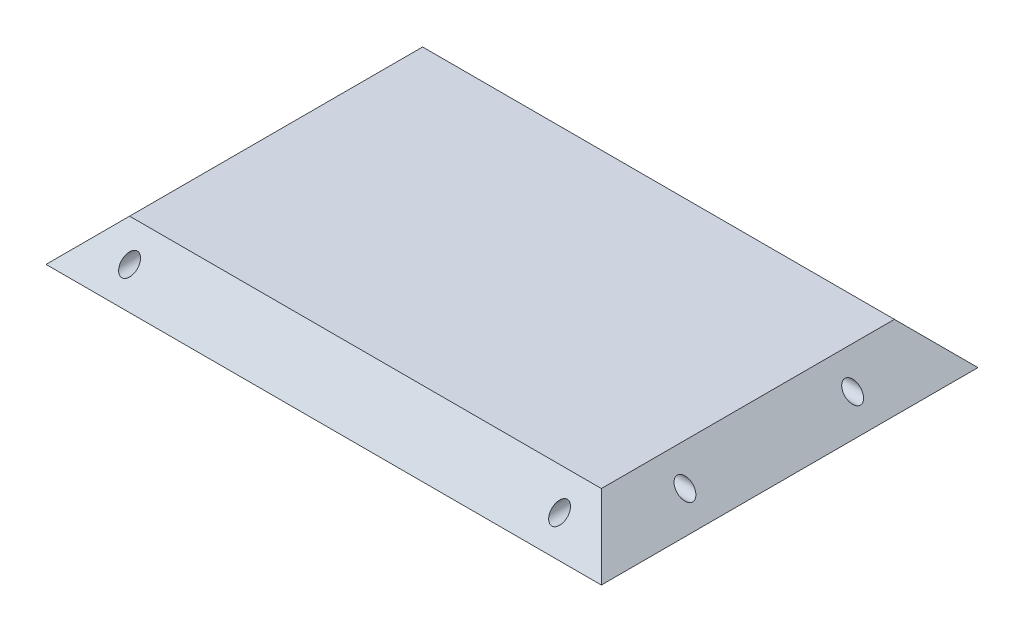
ISO-10303-21;
HEADER;
FILE_DESCRIPTION(('STEP AP214'),'2;1');
FILE_NAME('part.step','',(''),(''),'','','');
FILE_SCHEMA(('AUTOMOTIVE_DESIGN { 1 0 10303 214 1 1 1 1 }'));
ENDSEC;
DATA;
#1=APPLICATION_CONTEXT('core data for automotive mechanical design processes');
#2=APPLICATION_PROTOCOL_DEFINITION('international standard','automotive_design',2000,#1);
#3=PRODUCT_CONTEXT('',#1,'mechanical');
#4=PRODUCT('Part','Part','',(#3));
#5=PRODUCT_RELATED_PRODUCT_CATEGORY('part','',(#4));
#6=PRODUCT_DEFINITION_FORMATION('','',#4);
#7=PRODUCT_DEFINITION_CONTEXT('part definition',#1,'design');
#8=PRODUCT_DEFINITION('design','',#6,#7);
#9=PRODUCT_DEFINITION_SHAPE('','',#8);
#10=(LENGTH_UNIT() NAMED_UNIT(*) SI_UNIT(.MILLI.,.METRE.));
#11=(NAMED_UNIT(*) PLANE_ANGLE_UNIT() SI_UNIT($,.RADIAN.));
#12=(NAMED_UNIT(*) SI_UNIT($,.STERADIAN.) SOLID_ANGLE_UNIT());
#13=UNCERTAINTY_MEASURE_WITH_UNIT(LENGTH_MEASURE(1.E-05),#10,'distance_accuracy_value','');
#14=(GEOMETRIC_REPRESENTATION_CONTEXT(3) GLOBAL_UNCERTAINTY_ASSIGNED_CONTEXT((#13)) GLOBAL_UNIT_ASSIGNED_CONTEXT((#10,
#11,#12)) REPRESENTATION_CONTEXT('',''));
#15=CARTESIAN_POINT('',(0.,0.,0.));
#16=DIRECTION('',(0.,0.,1.));
#17=DIRECTION('',(1.,0.,0.));
#18=AXIS2_PLACEMENT_3D('',#15,#16,#17);
#19=CARTESIAN_POINT('',(-33.224504084014,33.224504084014,0.));
#20=DIRECTION('',(0.707106781186547,-0.707106781186547,0.));
#21=DIRECTION('',(0.707106781186548,0.707106781186547,0.));
#22=AXIS2_PLACEMENT_3D('',#19,#20,#21);
#23=PLANE('',#22);
#24=DIRECTION('',(0.577350269189626,0.577350269189626,-0.577350269189626));
#25=VECTOR('',#24,1.);
#26=CARTESIAN_POINT('',(-66.449008168028,0.,45.0615743649583));
#27=LINE('',#26,#25);
#28=CARTESIAN_POINT('',(-66.449008168028,0.,45.0615743649583));
#29=VERTEX_POINT('',#28);
#30=CARTESIAN_POINT('',(-56.449008168028,10.,35.0615743649583));
#31=VERTEX_POINT('',#30);
#32=EDGE_CURVE('E72',#29,#31,#27,.T.);
#33=ORIENTED_EDGE('',*,*,#32,.T.);
#34=DIRECTION('',(0.,0.,1.));
#35=VECTOR('',#34,1.);
#36=CARTESIAN_POINT('',(-56.449008168028,10.,-35.0615743649583));
#37=LINE('',#36,#35);
#38=CARTESIAN_POINT('',(-56.449008168028,10.,-35.0615743649583));
#39=VERTEX_POINT('',#38);
#40=EDGE_CURVE('E57',#39,#31,#37,.T.);
#41=ORIENTED_EDGE('',*,*,#40,.F.);
#42=DIRECTION('',(0.577350269189626,0.577350269189626,0.577350269189626));
#43=VECTOR('',#42,1.);
#44=CARTESIAN_POINT('',(-66.449008168028,0.,-45.0615743649583));
#45=LINE('',#44,#43);
#46=CARTESIAN_POINT('',(-66.449008168028,0.,-45.0615743649583));
#47=VERTEX_POINT('',#46);
#48=EDGE_CURVE('E112',#47,#39,#45,.T.);
#49=ORIENTED_EDGE('',*,*,#48,.F.);
#50=DIRECTION('',(0.,0.,1.));
#51=VECTOR('',#50,1.);
#52=CARTESIAN_POINT('',(-66.449008168028,0.,45.0615743649583));
#53=LINE('',#52,#51);
#54=EDGE_CURVE('E90',#47,#29,#53,.T.);
#55=ORIENTED_EDGE('',*,*,#54,.T.);
#56=EDGE_LOOP('',(#33,#41,#49,#55));
#57=FACE_BOUND('',#56,.T.);
#58=CARTESIAN_POINT('',(-61.449008168028,5.,20.0615743649583));
#59=DIRECTION('',(0.707106781186547,-0.707106781186547,0.));
#60=DIRECTION('',(-0.707106781186548,-0.707106781186547,0.));
#61=AXIS2_PLACEMENT_3D('',#58,#59,#60);
#62=ELLIPSE('',#61,2.61629509039023,1.85);
#63=CARTESIAN_POINT('',(-63.299008168028,3.15,20.0615743649583));
#64=VERTEX_POINT('',#63);
#65=EDGE_CURVE('E247',#64,#64,#62,.F.);
#66=ORIENTED_EDGE('',*,*,#65,.F.);
#67=EDGE_LOOP('',(#66));
#68=FACE_BOUND('',#67,.T.);
#69=CARTESIAN_POINT('',(-61.449008168028,5.,-20.0615743649583));
#70=DIRECTION('',(0.707106781186547,-0.707106781186547,0.));
#71=DIRECTION('',(-0.707106781186548,-0.707106781186547,0.));
#72=AXIS2_PLACEMENT_3D('',#69,#70,#71);
#73=ELLIPSE('',#72,2.61629509039023,1.85);
#74=CARTESIAN_POINT('',(-63.299008168028,3.15,-20.0615743649583));
#75=VERTEX_POINT('',#74);
#76=EDGE_CURVE('E52',#75,#75,#73,.T.);
#77=ORIENTED_EDGE('',*,*,#76,.T.);
#78=EDGE_LOOP('',(#77));
#79=FACE_BOUND('',#78,.T.);
#80=ADVANCED_FACE('F47',(#57,#68,#79),#23,.F.);
#81=CARTESIAN_POINT('',(33.224504084014,33.224504084014,0.));
#82=DIRECTION('',(-0.707106781186547,-0.707106781186547,0.));
#83=DIRECTION('',(0.707106781186548,-0.707106781186547,0.));
#84=AXIS2_PLACEMENT_3D('',#81,#82,#83);
#85=PLANE('',#84);
#86=CARTESIAN_POINT('',(61.449008168028,5.,20.0615743649583));
#87=DIRECTION('',(-0.707106781186547,-0.707106781186547,0.));
#88=DIRECTION('',(0.707106781186548,-0.707106781186547,0.));
#89=AXIS2_PLACEMENT_3D('',#86,#87,#88);
#90=ELLIPSE('',#89,2.61629509039023,1.85);
#91=CARTESIAN_POINT('',(63.299008168028,3.15,20.0615743649583));
#92=VERTEX_POINT('',#91);
#93=EDGE_CURVE('E240',#92,#92,#90,.T.);
#94=ORIENTED_EDGE('',*,*,#93,.T.);
#95=EDGE_LOOP('',(#94));
#96=FACE_BOUND('',#95,.T.);
#97=DIRECTION('',(-0.577350269189626,0.577350269189626,0.577350269189626));
#98=VECTOR('',#97,1.);
#99=CARTESIAN_POINT('',(66.449008168028,0.,-45.0615743649583));
#100=LINE('',#99,#98);
#101=CARTESIAN_POINT('',(66.449008168028,0.,-45.0615743649583));
#102=VERTEX_POINT('',#101);
#103=CARTESIAN_POINT('',(56.449008168028,10.,-35.0615743649583));
#104=VERTEX_POINT('',#103);
#105=EDGE_CURVE('E115',#102,#104,#100,.T.);
#106=ORIENTED_EDGE('',*,*,#105,.T.);
#107=DIRECTION('',(0.,0.,-1.));
#108=VECTOR('',#107,1.);
#109=CARTESIAN_POINT('',(56.449008168028,10.,35.0615743649583));
#110=LINE('',#109,#108);
#111=CARTESIAN_POINT('',(56.449008168028,10.,35.0615743649583));
#112=VERTEX_POINT('',#111);
#113=EDGE_CURVE('E213',#112,#104,#110,.T.);
#114=ORIENTED_EDGE('',*,*,#113,.F.);
#115=DIRECTION('',(-0.577350269189626,0.577350269189626,-0.577350269189626));
#116=VECTOR('',#115,1.);
#117=CARTESIAN_POINT('',(66.449008168028,0.,45.0615743649583));
#118=LINE('',#117,#116);
#119=CARTESIAN_POINT('',(66.449008168028,0.,45.0615743649583));
#120=VERTEX_POINT('',#119);
#121=EDGE_CURVE('E122',#120,#112,#118,.T.);
#122=ORIENTED_EDGE('',*,*,#121,.F.);
#123=DIRECTION('',(0.,0.,-1.));
#124=VECTOR('',#123,1.);
#125=CARTESIAN_POINT('',(66.449008168028,0.,45.0615743649583));
#126=LINE('',#125,#124);
#127=EDGE_CURVE('E116',#120,#102,#126,.T.);
#128=ORIENTED_EDGE('',*,*,#127,.T.);
#129=EDGE_LOOP('',(#106,#114,#122,#128));
#130=FACE_BOUND('',#129,.T.);
#131=CARTESIAN_POINT('',(61.449008168028,5.,-20.0615743649583));
#132=DIRECTION('',(-0.707106781186547,-0.707106781186547,0.));
#133=DIRECTION('',(0.707106781186548,-0.707106781186547,0.));
#134=AXIS2_PLACEMENT_3D('',#131,#132,#133);
#135=ELLIPSE('',#134,2.61629509039023,1.85);
#136=CARTESIAN_POINT('',(63.299008168028,3.15,-20.0615743649583));
#137=VERTEX_POINT('',#136);
#138=EDGE_CURVE('E243',#137,#137,#135,.F.);
#139=ORIENTED_EDGE('',*,*,#138,.F.);
#140=EDGE_LOOP('',(#139));
#141=FACE_BOUND('',#140,.T.);
#142=ADVANCED_FACE('F146',(#96,#130,#141),#85,.F.);
#143=CARTESIAN_POINT('',(0.,22.5307871824791,-22.5307871824791));
#144=DIRECTION('',(0.,-0.707106781186547,0.707106781186547));
#145=DIRECTION('',(0.,-0.707106781186547,-0.707106781186548));
#146=AXIS2_PLACEMENT_3D('',#143,#144,#145);
#147=PLANE('',#146);
#148=CARTESIAN_POINT('',(-51.449008168028,5.,-40.0615743649582));
#149=DIRECTION('',(0.,-0.707106781186547,0.707106781186547));
#150=DIRECTION('',(0.,-0.707106781186547,-0.707106781186548));
#151=AXIS2_PLACEMENT_3D('',#148,#149,#150);
#152=ELLIPSE('',#151,2.61629509039022,1.85);
#153=CARTESIAN_POINT('',(-51.449008168028,3.15,-41.9115743649582));
#154=VERTEX_POINT('',#153);
#155=EDGE_CURVE('E232',#154,#154,#152,.T.);
#156=ORIENTED_EDGE('',*,*,#155,.T.);
#157=EDGE_LOOP('',(#156));
#158=FACE_BOUND('',#157,.T.);
#159=ORIENTED_EDGE('',*,*,#48,.T.);
#160=DIRECTION('',(-1.,0.,0.));
#161=VECTOR('',#160,1.);
#162=CARTESIAN_POINT('',(56.449008168028,10.,-35.0615743649583));
#163=LINE('',#162,#161);
#164=EDGE_CURVE('E207',#104,#39,#163,.T.);
#165=ORIENTED_EDGE('',*,*,#164,.F.);
#166=ORIENTED_EDGE('',*,*,#105,.F.);
#167=DIRECTION('',(-1.,0.,0.));
#168=VECTOR('',#167,1.);
#169=CARTESIAN_POINT('',(-66.449008168028,0.,-45.0615743649583));
#170=LINE('',#169,#168);
#171=EDGE_CURVE('E95',#102,#47,#170,.T.);
#172=ORIENTED_EDGE('',*,*,#171,.T.);
#173=EDGE_LOOP('',(#159,#165,#166,#172));
#174=FACE_BOUND('',#173,.T.);
#175=CARTESIAN_POINT('',(51.449008168028,5.,-40.0615743649582));
#176=DIRECTION('',(0.,-0.707106781186547,0.707106781186547));
#177=DIRECTION('',(0.,-0.707106781186547,-0.707106781186548));
#178=AXIS2_PLACEMENT_3D('',#175,#176,#177);
#179=ELLIPSE('',#178,2.61629509039022,1.85);
#180=CARTESIAN_POINT('',(51.449008168028,3.15,-41.9115743649582));
#181=VERTEX_POINT('',#180);
#182=EDGE_CURVE('E235',#181,#181,#179,.F.);
#183=ORIENTED_EDGE('',*,*,#182,.F.);
#184=EDGE_LOOP('',(#183));
#185=FACE_BOUND('',#184,.T.);
#186=ADVANCED_FACE('F110',(#158,#174,#185),#147,.F.);
#187=CARTESIAN_POINT('',(0.,22.5307871824791,22.5307871824791));
#188=DIRECTION('',(0.,-0.707106781186547,-0.707106781186547));
#189=DIRECTION('',(0.,0.707106781186547,-0.707106781186548));
#190=AXIS2_PLACEMENT_3D('',#187,#188,#189);
#191=PLANE('',#190);
#192=ORIENTED_EDGE('',*,*,#121,.T.);
#193=DIRECTION('',(1.,0.,0.));
#194=VECTOR('',#193,1.);
#195=CARTESIAN_POINT('',(-56.449008168028,10.,35.0615743649583));
#196=LINE('',#195,#194);
#197=EDGE_CURVE('E12',#31,#112,#196,.T.);
#198=ORIENTED_EDGE('',*,*,#197,.F.);
#199=ORIENTED_EDGE('',*,*,#32,.F.);
#200=DIRECTION('',(1.,0.,0.));
#201=VECTOR('',#200,1.);
#202=CARTESIAN_POINT('',(-66.449008168028,0.,45.0615743649583));
#203=LINE('',#202,#201);
#204=EDGE_CURVE('E99',#29,#120,#203,.T.);
#205=ORIENTED_EDGE('',*,*,#204,.T.);
#206=EDGE_LOOP('',(#192,#198,#199,#205));
#207=FACE_BOUND('',#206,.T.);
#208=CARTESIAN_POINT('',(-51.449008168028,5.,40.0615743649582));
#209=DIRECTION('',(0.,-0.707106781186547,-0.707106781186547));
#210=DIRECTION('',(0.,-0.707106781186547,0.707106781186548));
#211=AXIS2_PLACEMENT_3D('',#208,#209,#210);
#212=ELLIPSE('',#211,2.61629509039022,1.85);
#213=CARTESIAN_POINT('',(-51.449008168028,3.15,41.9115743649582));
#214=VERTEX_POINT('',#213);
#215=EDGE_CURVE('E220',#214,#214,#212,.F.);
#216=ORIENTED_EDGE('',*,*,#215,.F.);
#217=EDGE_LOOP('',(#216));
#218=FACE_BOUND('',#217,.T.);
#219=CARTESIAN_POINT('',(51.449008168028,5.,40.0615743649582));
#220=DIRECTION('',(0.,-0.707106781186547,-0.707106781186547));
#221=DIRECTION('',(0.,-0.707106781186547,0.707106781186548));
#222=AXIS2_PLACEMENT_3D('',#219,#220,#221);
#223=ELLIPSE('',#222,2.61629509039022,1.85);
#224=CARTESIAN_POINT('',(51.449008168028,3.15,41.9115743649582));
#225=VERTEX_POINT('',#224);
#226=EDGE_CURVE('E228',#225,#225,#223,.T.);
#227=ORIENTED_EDGE('',*,*,#226,.T.);
#228=EDGE_LOOP('',(#227));
#229=FACE_BOUND('',#228,.T.);
#230=ADVANCED_FACE('F279',(#207,#218,#229),#191,.F.);
#231=CARTESIAN_POINT('',(0.,10.,0.));
#232=DIRECTION('',(0.,1.,0.));
#233=DIRECTION('',(0.,0.,1.));
#234=AXIS2_PLACEMENT_3D('',#231,#232,#233);
#235=PLANE('',#234);
#236=ORIENTED_EDGE('',*,*,#113,.T.);
#237=ORIENTED_EDGE('',*,*,#164,.T.);
#238=ORIENTED_EDGE('',*,*,#40,.T.);
#239=ORIENTED_EDGE('',*,*,#197,.T.);
#240=EDGE_LOOP('',(#236,#237,#238,#239));
#241=FACE_BOUND('',#240,.T.);
#242=ADVANCED_FACE('F49',(#241),#235,.T.);
#243=CARTESIAN_POINT('',(0.,0.,0.));
#244=DIRECTION('',(0.,-1.,0.));
#245=DIRECTION('',(0.,0.,-1.));
#246=AXIS2_PLACEMENT_3D('',#243,#244,#245);
#247=PLANE('',#246);
#248=ORIENTED_EDGE('',*,*,#127,.F.);
#249=ORIENTED_EDGE('',*,*,#204,.F.);
#250=ORIENTED_EDGE('',*,*,#54,.F.);
#251=ORIENTED_EDGE('',*,*,#171,.F.);
#252=EDGE_LOOP('',(#248,#249,#250,#251));
#253=FACE_BOUND('',#252,.T.);
#254=ADVANCED_FACE('F94',(#253),#247,.T.);
#255=CARTESIAN_POINT('',(-51.449008168028,5.,25.0615743649583));
#256=DIRECTION('',(0.,0.,1.));
#257=DIRECTION('',(1.,0.,0.));
#258=AXIS2_PLACEMENT_3D('',#255,#256,#257);
#259=CYLINDRICAL_SURFACE('',#258,1.85);
#260=CARTESIAN_POINT('',(-51.449008168028,5.,25.0615743649583));
#261=DIRECTION('',(0.,0.,-1.));
#262=DIRECTION('',(-1.,0.,0.));
#263=AXIS2_PLACEMENT_3D('',#260,#261,#262);
#264=CIRCLE('',#263,1.85);
#265=CARTESIAN_POINT('',(-53.299008168028,5.,25.0615743649583));
#266=VERTEX_POINT('',#265);
#267=EDGE_CURVE('E239',#266,#266,#264,.T.);
#268=ORIENTED_EDGE('',*,*,#267,.T.);
#269=EDGE_LOOP('',(#268));
#270=FACE_BOUND('',#269,.T.);
#271=ORIENTED_EDGE('',*,*,#215,.T.);
#272=EDGE_LOOP('',(#271));
#273=FACE_BOUND('',#272,.T.);
#274=ADVANCED_FACE('F355',(#270,#273),#259,.F.);
#275=CARTESIAN_POINT('',(-51.449008168028,5.,25.0615743649583));
#276=DIRECTION('',(0.,0.,-1.));
#277=DIRECTION('',(-1.,0.,0.));
#278=AXIS2_PLACEMENT_3D('',#275,#276,#277);
#279=PLANE('',#278);
#280=ORIENTED_EDGE('',*,*,#267,.F.);
#281=EDGE_LOOP('',(#280));
#282=FACE_BOUND('',#281,.T.);
#283=ADVANCED_FACE('F345',(#282),#279,.F.);
#284=CARTESIAN_POINT('',(51.449008168028,5.,25.0615743649583));
#285=DIRECTION('',(0.,0.,1.));
#286=DIRECTION('',(1.,0.,0.));
#287=AXIS2_PLACEMENT_3D('',#284,#285,#286);
#288=CYLINDRICAL_SURFACE('',#287,1.85);
#289=CARTESIAN_POINT('',(51.449008168028,5.,25.0615743649583));
#290=DIRECTION('',(0.,0.,1.));
#291=DIRECTION('',(1.,0.,0.));
#292=AXIS2_PLACEMENT_3D('',#289,#290,#291);
#293=CIRCLE('',#292,1.85);
#294=CARTESIAN_POINT('',(53.299008168028,5.,25.0615743649583));
#295=VERTEX_POINT('',#294);
#296=EDGE_CURVE('E229',#295,#295,#293,.T.);
#297=ORIENTED_EDGE('',*,*,#296,.F.);
#298=EDGE_LOOP('',(#297));
#299=FACE_BOUND('',#298,.T.);
#300=ORIENTED_EDGE('',*,*,#226,.F.);
#301=EDGE_LOOP('',(#300));
#302=FACE_BOUND('',#301,.T.);
#303=ADVANCED_FACE('F342',(#299,#302),#288,.F.);
#304=CARTESIAN_POINT('',(51.449008168028,5.,25.0615743649583));
#305=DIRECTION('',(0.,0.,1.));
#306=DIRECTION('',(1.,0.,0.));
#307=AXIS2_PLACEMENT_3D('',#304,#305,#306);
#308=PLANE('',#307);
#309=ORIENTED_EDGE('',*,*,#296,.T.);
#310=EDGE_LOOP('',(#309));
#311=FACE_BOUND('',#310,.T.);
#312=ADVANCED_FACE('F344',(#311),#308,.T.);
#313=CARTESIAN_POINT('',(-51.449008168028,5.,-25.0615743649583));
#314=DIRECTION('',(0.,0.,-1.));
#315=DIRECTION('',(-1.,0.,0.));
#316=AXIS2_PLACEMENT_3D('',#313,#314,#315);
#317=CYLINDRICAL_SURFACE('',#316,1.85);
#318=CARTESIAN_POINT('',(-51.449008168028,5.,-25.0615743649583));
#319=DIRECTION('',(0.,0.,-1.));
#320=DIRECTION('',(-1.,0.,0.));
#321=AXIS2_PLACEMENT_3D('',#318,#319,#320);
#322=CIRCLE('',#321,1.85);
#323=CARTESIAN_POINT('',(-53.299008168028,5.,-25.0615743649583));
#324=VERTEX_POINT('',#323);
#325=EDGE_CURVE('E246',#324,#324,#322,.T.);
#326=ORIENTED_EDGE('',*,*,#325,.F.);
#327=EDGE_LOOP('',(#326));
#328=FACE_BOUND('',#327,.T.);
#329=ORIENTED_EDGE('',*,*,#155,.F.);
#330=EDGE_LOOP('',(#329));
#331=FACE_BOUND('',#330,.T.);
#332=ADVANCED_FACE('F352',(#328,#331),#317,.F.);
#333=CARTESIAN_POINT('',(-51.449008168028,5.,-25.0615743649583));
#334=DIRECTION('',(0.,0.,1.));
#335=DIRECTION('',(-1.,0.,0.));
#336=AXIS2_PLACEMENT_3D('',#333,#334,#335);
#337=PLANE('',#336);
#338=ORIENTED_EDGE('',*,*,#325,.T.);
#339=EDGE_LOOP('',(#338));
#340=FACE_BOUND('',#339,.T.);
#341=ADVANCED_FACE('F467',(#340),#337,.F.);
#342=CARTESIAN_POINT('',(51.449008168028,5.,-25.0615743649583));
#343=DIRECTION('',(0.,0.,-1.));
#344=DIRECTION('',(-1.,0.,0.));
#345=AXIS2_PLACEMENT_3D('',#342,#343,#344);
#346=CYLINDRICAL_SURFACE('',#345,1.85);
#347=CARTESIAN_POINT('',(51.449008168028,5.,-25.0615743649583));
#348=DIRECTION('',(0.,0.,1.));
#349=DIRECTION('',(1.,0.,0.));
#350=AXIS2_PLACEMENT_3D('',#347,#348,#349);
#351=CIRCLE('',#350,1.85);
#352=CARTESIAN_POINT('',(53.299008168028,5.,-25.0615743649583));
#353=VERTEX_POINT('',#352);
#354=EDGE_CURVE('E236',#353,#353,#351,.T.);
#355=ORIENTED_EDGE('',*,*,#354,.T.);
#356=EDGE_LOOP('',(#355));
#357=FACE_BOUND('',#356,.T.);
#358=ORIENTED_EDGE('',*,*,#182,.T.);
#359=EDGE_LOOP('',(#358));
#360=FACE_BOUND('',#359,.T.);
#361=ADVANCED_FACE('F463',(#357,#360),#346,.F.);
#362=CARTESIAN_POINT('',(51.449008168028,5.,-25.0615743649583));
#363=DIRECTION('',(0.,0.,-1.));
#364=DIRECTION('',(1.,0.,0.));
#365=AXIS2_PLACEMENT_3D('',#362,#363,#364);
#366=PLANE('',#365);
#367=ORIENTED_EDGE('',*,*,#354,.F.);
#368=EDGE_LOOP('',(#367));
#369=FACE_BOUND('',#368,.T.);
#370=ADVANCED_FACE('F456',(#369),#366,.T.);
#371=CARTESIAN_POINT('',(46.449008168028,5.,20.0615743649583));
#372=DIRECTION('',(1.,0.,0.));
#373=DIRECTION('',(0.,0.,-1.));
#374=AXIS2_PLACEMENT_3D('',#371,#372,#373);
#375=CYLINDRICAL_SURFACE('',#374,1.85);
#376=CARTESIAN_POINT('',(46.449008168028,5.,20.0615743649583));
#377=DIRECTION('',(1.,0.,0.));
#378=DIRECTION('',(0.,0.,-1.));
#379=AXIS2_PLACEMENT_3D('',#376,#377,#378);
#380=CIRCLE('',#379,1.85);
#381=CARTESIAN_POINT('',(46.449008168028,5.,18.2115743649583));
#382=VERTEX_POINT('',#381);
#383=EDGE_CURVE('E253',#382,#382,#380,.T.);
#384=ORIENTED_EDGE('',*,*,#383,.F.);
#385=EDGE_LOOP('',(#384));
#386=FACE_BOUND('',#385,.T.);
#387=ORIENTED_EDGE('',*,*,#93,.F.);
#388=EDGE_LOOP('',(#387));
#389=FACE_BOUND('',#388,.T.);
#390=ADVANCED_FACE('F453',(#386,#389),#375,.F.);
#391=CARTESIAN_POINT('',(46.449008168028,5.,20.0615743649583));
#392=DIRECTION('',(1.,0.,0.));
#393=DIRECTION('',(0.,0.,-1.));
#394=AXIS2_PLACEMENT_3D('',#391,#392,#393);
#395=PLANE('',#394);
#396=ORIENTED_EDGE('',*,*,#383,.T.);
#397=EDGE_LOOP('',(#396));
#398=FACE_BOUND('',#397,.T.);
#399=ADVANCED_FACE('F451',(#398),#395,.T.);
#400=CARTESIAN_POINT('',(46.449008168028,5.,-20.0615743649583));
#401=DIRECTION('',(1.,0.,0.));
#402=DIRECTION('',(0.,0.,-1.));
#403=AXIS2_PLACEMENT_3D('',#400,#401,#402);
#404=CYLINDRICAL_SURFACE('',#403,1.85);
#405=CARTESIAN_POINT('',(46.449008168028,5.,-20.0615743649583));
#406=DIRECTION('',(-1.,0.,0.));
#407=DIRECTION('',(0.,0.,1.));
#408=AXIS2_PLACEMENT_3D('',#405,#406,#407);
#409=CIRCLE('',#408,1.85);
#410=CARTESIAN_POINT('',(46.449008168028,5.,-18.2115743649583));
#411=VERTEX_POINT('',#410);
#412=EDGE_CURVE('E244',#411,#411,#409,.T.);
#413=ORIENTED_EDGE('',*,*,#412,.T.);
#414=EDGE_LOOP('',(#413));
#415=FACE_BOUND('',#414,.T.);
#416=ORIENTED_EDGE('',*,*,#138,.T.);
#417=EDGE_LOOP('',(#416));
#418=FACE_BOUND('',#417,.T.);
#419=ADVANCED_FACE('F447',(#415,#418),#404,.F.);
#420=CARTESIAN_POINT('',(46.449008168028,5.,-20.0615743649583));
#421=DIRECTION('',(-1.,0.,0.));
#422=DIRECTION('',(0.,0.,1.));
#423=AXIS2_PLACEMENT_3D('',#420,#421,#422);
#424=PLANE('',#423);
#425=ORIENTED_EDGE('',*,*,#412,.F.);
#426=EDGE_LOOP('',(#425));
#427=FACE_BOUND('',#426,.T.);
#428=ADVANCED_FACE('F404',(#427),#424,.F.);
#429=CARTESIAN_POINT('',(-46.449008168028,5.,20.0615743649583));
#430=DIRECTION('',(-1.,0.,0.));
#431=DIRECTION('',(0.,0.,1.));
#432=AXIS2_PLACEMENT_3D('',#429,#430,#431);
#433=CYLINDRICAL_SURFACE('',#432,1.85);
#434=CARTESIAN_POINT('',(-46.449008168028,5.,20.0615743649583));
#435=DIRECTION('',(1.,0.,0.));
#436=DIRECTION('',(0.,0.,-1.));
#437=AXIS2_PLACEMENT_3D('',#434,#435,#436);
#438=CIRCLE('',#437,1.85);
#439=CARTESIAN_POINT('',(-46.449008168028,5.,18.2115743649583));
#440=VERTEX_POINT('',#439);
#441=EDGE_CURVE('E255',#440,#440,#438,.T.);
#442=ORIENTED_EDGE('',*,*,#441,.T.);
#443=EDGE_LOOP('',(#442));
#444=FACE_BOUND('',#443,.T.);
#445=ORIENTED_EDGE('',*,*,#65,.T.);
#446=EDGE_LOOP('',(#445));
#447=FACE_BOUND('',#446,.T.);
#448=ADVANCED_FACE('F408',(#444,#447),#433,.F.);
#449=CARTESIAN_POINT('',(-46.449008168028,5.,20.0615743649583));
#450=DIRECTION('',(-1.,0.,0.));
#451=DIRECTION('',(0.,0.,-1.));
#452=AXIS2_PLACEMENT_3D('',#449,#450,#451);
#453=PLANE('',#452);
#454=ORIENTED_EDGE('',*,*,#441,.F.);
#455=EDGE_LOOP('',(#454));
#456=FACE_BOUND('',#455,.T.);
#457=ADVANCED_FACE('F412',(#456),#453,.T.);
#458=CARTESIAN_POINT('',(-46.449008168028,5.,-20.0615743649583));
#459=DIRECTION('',(-1.,0.,0.));
#460=DIRECTION('',(0.,0.,1.));
#461=AXIS2_PLACEMENT_3D('',#458,#459,#460);
#462=CYLINDRICAL_SURFACE('',#461,1.85);
#463=CARTESIAN_POINT('',(-46.449008168028,5.,-20.0615743649583));
#464=DIRECTION('',(-1.,0.,0.));
#465=DIRECTION('',(0.,0.,1.));
#466=AXIS2_PLACEMENT_3D('',#463,#464,#465);
#467=CIRCLE('',#466,1.85);
#468=CARTESIAN_POINT('',(-46.449008168028,5.,-18.2115743649583));
#469=VERTEX_POINT('',#468);
#470=EDGE_CURVE('E249',#469,#469,#467,.T.);
#471=ORIENTED_EDGE('',*,*,#470,.F.);
#472=EDGE_LOOP('',(#471));
#473=FACE_BOUND('',#472,.T.);
#474=ORIENTED_EDGE('',*,*,#76,.F.);
#475=EDGE_LOOP('',(#474));
#476=FACE_BOUND('',#475,.T.);
#477=ADVANCED_FACE('F422',(#473,#476),#462,.F.);
#478=CARTESIAN_POINT('',(-46.449008168028,5.,-20.0615743649583));
#479=DIRECTION('',(1.,0.,0.));
#480=DIRECTION('',(0.,0.,1.));
#481=AXIS2_PLACEMENT_3D('',#478,#479,#480);
#482=PLANE('',#481);
#483=ORIENTED_EDGE('',*,*,#470,.T.);
#484=EDGE_LOOP('',(#483));
#485=FACE_BOUND('',#484,.T.);
#486=ADVANCED_FACE('F432',(#485),#482,.F.);
#487=CLOSED_SHELL('',(#80,#142,#186,#230,#242,#254,#274,#283,#303,#312,#332,#341,#361,#370,#390,
#399,#419,#428,#448,#457,#477,#486));
#488=MANIFOLD_SOLID_BREP('B2',#487);
#489=ADVANCED_BREP_SHAPE_REPRESENTATION('',(#18,#488),#14);
#490=SHAPE_DEFINITION_REPRESENTATION(#9,#489);
ENDSEC;
END-ISO-10303-21;
